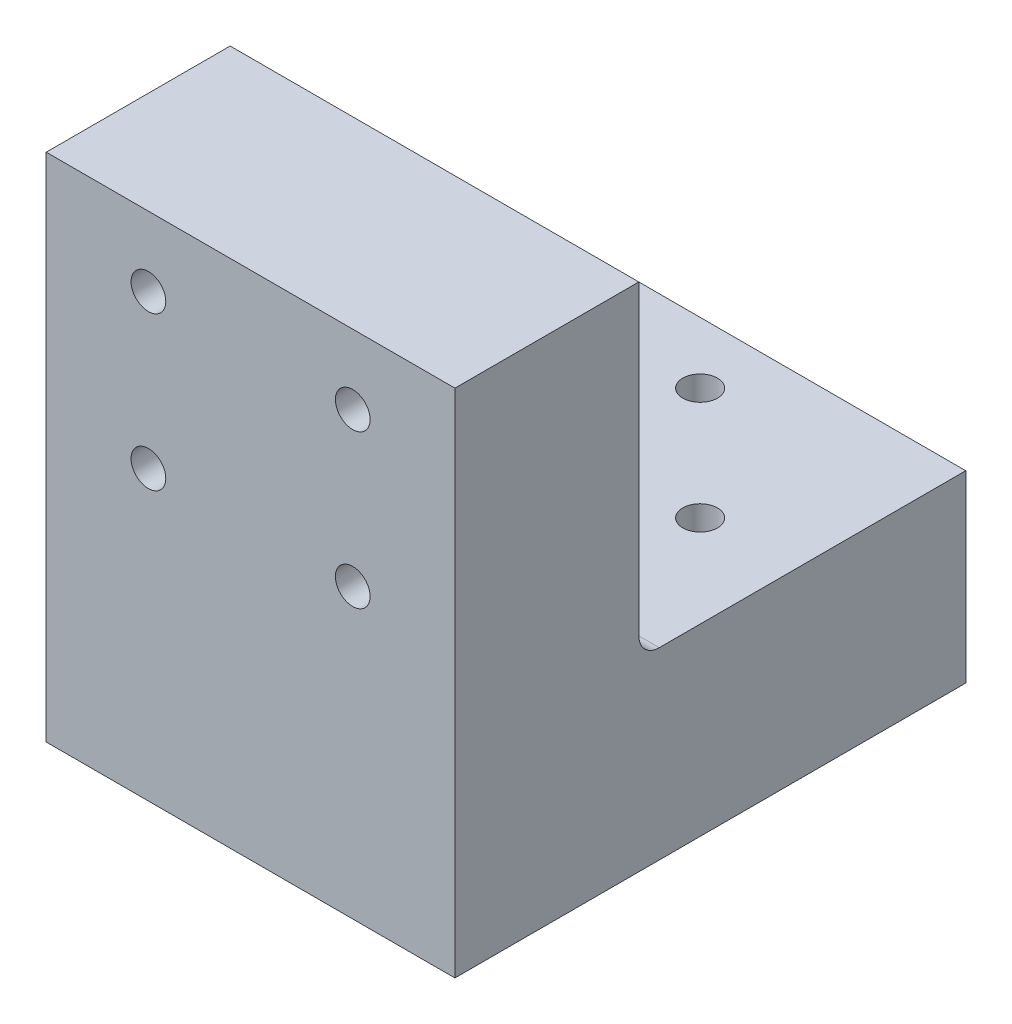
ISO-10303-21;
HEADER;
FILE_DESCRIPTION(('STEP AP214'),'2;1');
FILE_NAME('part.step','',(''),(''),'','','');
FILE_SCHEMA(('AUTOMOTIVE_DESIGN { 1 0 10303 214 1 1 1 1 }'));
ENDSEC;
DATA;
#1=APPLICATION_CONTEXT('core data for automotive mechanical design processes');
#2=APPLICATION_PROTOCOL_DEFINITION('international standard','automotive_design',2000,#1);
#3=PRODUCT_CONTEXT('',#1,'mechanical');
#4=PRODUCT('Part','Part','',(#3));
#5=PRODUCT_RELATED_PRODUCT_CATEGORY('part','',(#4));
#6=PRODUCT_DEFINITION_FORMATION('','',#4);
#7=PRODUCT_DEFINITION_CONTEXT('part definition',#1,'design');
#8=PRODUCT_DEFINITION('design','',#6,#7);
#9=PRODUCT_DEFINITION_SHAPE('','',#8);
#10=(LENGTH_UNIT() NAMED_UNIT(*) SI_UNIT(.MILLI.,.METRE.));
#11=(NAMED_UNIT(*) PLANE_ANGLE_UNIT() SI_UNIT($,.RADIAN.));
#12=(NAMED_UNIT(*) SI_UNIT($,.STERADIAN.) SOLID_ANGLE_UNIT());
#13=UNCERTAINTY_MEASURE_WITH_UNIT(LENGTH_MEASURE(1.E-05),#10,'distance_accuracy_value','');
#14=(GEOMETRIC_REPRESENTATION_CONTEXT(3) GLOBAL_UNCERTAINTY_ASSIGNED_CONTEXT((#13)) GLOBAL_UNIT_ASSIGNED_CONTEXT((#10,
#11,#12)) REPRESENTATION_CONTEXT('',''));
#15=CARTESIAN_POINT('',(0.,0.,0.));
#16=DIRECTION('',(0.,0.,1.));
#17=DIRECTION('',(1.,0.,0.));
#18=AXIS2_PLACEMENT_3D('',#15,#16,#17);
#19=CARTESIAN_POINT('',(40.,-23.186119873817,0.));
#20=DIRECTION('',(0.,0.,-1.));
#21=DIRECTION('',(-1.,0.,0.));
#22=AXIS2_PLACEMENT_3D('',#19,#20,#21);
#23=PLANE('',#22);
#24=CARTESIAN_POINT('',(10.,20.,0.));
#25=DIRECTION('',(0.,0.,-1.));
#26=DIRECTION('',(0.,1.,0.));
#27=AXIS2_PLACEMENT_3D('',#24,#25,#26);
#28=CIRCLE('',#27,1.7);
#29=CARTESIAN_POINT('',(10.,21.7,0.));
#30=VERTEX_POINT('',#29);
#31=EDGE_CURVE('E248',#30,#30,#28,.T.);
#32=ORIENTED_EDGE('',*,*,#31,.T.);
#33=EDGE_LOOP('',(#32));
#34=FACE_BOUND('',#33,.T.);
#35=CARTESIAN_POINT('',(30.,5.,0.));
#36=DIRECTION('',(0.,0.,-1.));
#37=DIRECTION('',(0.,1.,0.));
#38=AXIS2_PLACEMENT_3D('',#35,#36,#37);
#39=CIRCLE('',#38,1.7);
#40=CARTESIAN_POINT('',(30.,6.7,0.));
#41=VERTEX_POINT('',#40);
#42=EDGE_CURVE('E238',#41,#41,#39,.T.);
#43=ORIENTED_EDGE('',*,*,#42,.T.);
#44=EDGE_LOOP('',(#43));
#45=FACE_BOUND('',#44,.T.);
#46=CARTESIAN_POINT('',(10.,5.,0.));
#47=DIRECTION('',(0.,0.,-1.));
#48=DIRECTION('',(0.,1.,0.));
#49=AXIS2_PLACEMENT_3D('',#46,#47,#48);
#50=CIRCLE('',#49,1.7);
#51=CARTESIAN_POINT('',(10.,6.7,0.));
#52=VERTEX_POINT('',#51);
#53=EDGE_CURVE('E258',#52,#52,#50,.T.);
#54=ORIENTED_EDGE('',*,*,#53,.T.);
#55=EDGE_LOOP('',(#54));
#56=FACE_BOUND('',#55,.T.);
#57=CARTESIAN_POINT('',(30.,20.,0.));
#58=DIRECTION('',(0.,0.,-1.));
#59=DIRECTION('',(0.,1.,0.));
#60=AXIS2_PLACEMENT_3D('',#57,#58,#59);
#61=CIRCLE('',#60,1.7);
#62=CARTESIAN_POINT('',(30.,21.7,0.));
#63=VERTEX_POINT('',#62);
#64=EDGE_CURVE('E222',#63,#63,#61,.T.);
#65=ORIENTED_EDGE('',*,*,#64,.T.);
#66=EDGE_LOOP('',(#65));
#67=FACE_BOUND('',#66,.T.);
#68=DIRECTION('',(0.,-1.,0.));
#69=VECTOR('',#68,1.);
#70=CARTESIAN_POINT('',(0.,-23.186119873817,0.));
#71=LINE('',#70,#69);
#72=CARTESIAN_POINT('',(0.,26.813880126183,0.));
#73=VERTEX_POINT('',#72);
#74=CARTESIAN_POINT('',(0.,-23.186119873817,0.));
#75=VERTEX_POINT('',#74);
#76=EDGE_CURVE('E139',#73,#75,#71,.T.);
#77=ORIENTED_EDGE('',*,*,#76,.T.);
#78=DIRECTION('',(-1.,0.,0.));
#79=VECTOR('',#78,1.);
#80=CARTESIAN_POINT('',(40.,-23.186119873817,0.));
#81=LINE('',#80,#79);
#82=CARTESIAN_POINT('',(40.,-23.186119873817,0.));
#83=VERTEX_POINT('',#82);
#84=EDGE_CURVE('E11',#83,#75,#81,.T.);
#85=ORIENTED_EDGE('',*,*,#84,.F.);
#86=DIRECTION('',(0.,-1.,0.));
#87=VECTOR('',#86,1.);
#88=CARTESIAN_POINT('',(40.,-23.186119873817,0.));
#89=LINE('',#88,#87);
#90=CARTESIAN_POINT('',(40.,26.813880126183,0.));
#91=VERTEX_POINT('',#90);
#92=EDGE_CURVE('E159',#91,#83,#89,.T.);
#93=ORIENTED_EDGE('',*,*,#92,.F.);
#94=DIRECTION('',(-1.,0.,0.));
#95=VECTOR('',#94,1.);
#96=CARTESIAN_POINT('',(40.,26.813880126183,0.));
#97=LINE('',#96,#95);
#98=EDGE_CURVE('E136',#91,#73,#97,.T.);
#99=ORIENTED_EDGE('',*,*,#98,.T.);
#100=EDGE_LOOP('',(#77,#85,#93,#99));
#101=FACE_BOUND('',#100,.T.);
#102=ADVANCED_FACE('F44',(#34,#45,#56,#67,#101),#23,.F.);
#103=CARTESIAN_POINT('',(40.,-23.186119873817,0.));
#104=DIRECTION('',(0.,1.,0.));
#105=DIRECTION('',(0.,0.,1.));
#106=AXIS2_PLACEMENT_3D('',#103,#104,#105);
#107=PLANE('',#106);
#108=CARTESIAN_POINT('',(9.,-23.186119873817,-33.));
#109=DIRECTION('',(0.,1.,0.));
#110=DIRECTION('',(0.,0.,1.));
#111=AXIS2_PLACEMENT_3D('',#108,#109,#110);
#112=CIRCLE('',#111,1.7);
#113=CARTESIAN_POINT('',(9.,-23.186119873817,-31.3));
#114=VERTEX_POINT('',#113);
#115=EDGE_CURVE('E207',#114,#114,#112,.T.);
#116=ORIENTED_EDGE('',*,*,#115,.T.);
#117=EDGE_LOOP('',(#116));
#118=FACE_BOUND('',#117,.T.);
#119=CARTESIAN_POINT('',(20.,-23.186119873817,-44.));
#120=DIRECTION('',(0.,1.,0.));
#121=DIRECTION('',(0.,0.,1.));
#122=AXIS2_PLACEMENT_3D('',#119,#120,#121);
#123=CIRCLE('',#122,1.7);
#124=CARTESIAN_POINT('',(20.,-23.186119873817,-42.3));
#125=VERTEX_POINT('',#124);
#126=EDGE_CURVE('E199',#125,#125,#123,.T.);
#127=ORIENTED_EDGE('',*,*,#126,.T.);
#128=EDGE_LOOP('',(#127));
#129=FACE_BOUND('',#128,.T.);
#130=CARTESIAN_POINT('',(31.,-23.186119873817,-33.));
#131=DIRECTION('',(0.,1.,0.));
#132=DIRECTION('',(0.,0.,1.));
#133=AXIS2_PLACEMENT_3D('',#130,#131,#132);
#134=CIRCLE('',#133,1.7);
#135=CARTESIAN_POINT('',(31.,-23.186119873817,-31.3));
#136=VERTEX_POINT('',#135);
#137=EDGE_CURVE('E223',#136,#136,#134,.T.);
#138=ORIENTED_EDGE('',*,*,#137,.T.);
#139=EDGE_LOOP('',(#138));
#140=FACE_BOUND('',#139,.T.);
#141=CARTESIAN_POINT('',(20.,-23.186119873817,-22.));
#142=DIRECTION('',(0.,1.,0.));
#143=DIRECTION('',(0.,0.,1.));
#144=AXIS2_PLACEMENT_3D('',#141,#142,#143);
#145=CIRCLE('',#144,1.7);
#146=CARTESIAN_POINT('',(20.,-23.186119873817,-20.3));
#147=VERTEX_POINT('',#146);
#148=EDGE_CURVE('E216',#147,#147,#145,.T.);
#149=ORIENTED_EDGE('',*,*,#148,.T.);
#150=EDGE_LOOP('',(#149));
#151=FACE_BOUND('',#150,.T.);
#152=CARTESIAN_POINT('',(20.,-23.186119873817,-33.));
#153=DIRECTION('',(0.,1.,0.));
#154=DIRECTION('',(0.,0.,1.));
#155=AXIS2_PLACEMENT_3D('',#152,#153,#154);
#156=CIRCLE('',#155,3.25000000000001);
#157=CARTESIAN_POINT('',(20.,-23.186119873817,-29.75));
#158=VERTEX_POINT('',#157);
#159=EDGE_CURVE('E144',#158,#158,#156,.T.);
#160=ORIENTED_EDGE('',*,*,#159,.T.);
#161=EDGE_LOOP('',(#160));
#162=FACE_BOUND('',#161,.T.);
#163=DIRECTION('',(0.,0.,-1.));
#164=VECTOR('',#163,1.);
#165=CARTESIAN_POINT('',(0.,-23.186119873817,0.));
#166=LINE('',#165,#164);
#167=CARTESIAN_POINT('',(0.,-23.186119873817,-50.));
#168=VERTEX_POINT('',#167);
#169=EDGE_CURVE('E145',#75,#168,#166,.T.);
#170=ORIENTED_EDGE('',*,*,#169,.T.);
#171=DIRECTION('',(-1.,0.,0.));
#172=VECTOR('',#171,1.);
#173=CARTESIAN_POINT('',(40.,-23.186119873817,-50.));
#174=LINE('',#173,#172);
#175=CARTESIAN_POINT('',(40.,-23.186119873817,-50.));
#176=VERTEX_POINT('',#175);
#177=EDGE_CURVE('E53',#176,#168,#174,.T.);
#178=ORIENTED_EDGE('',*,*,#177,.F.);
#179=DIRECTION('',(0.,0.,-1.));
#180=VECTOR('',#179,1.);
#181=CARTESIAN_POINT('',(40.,-23.186119873817,0.));
#182=LINE('',#181,#180);
#183=EDGE_CURVE('E105',#83,#176,#182,.T.);
#184=ORIENTED_EDGE('',*,*,#183,.F.);
#185=ORIENTED_EDGE('',*,*,#84,.T.);
#186=EDGE_LOOP('',(#170,#178,#184,#185));
#187=FACE_BOUND('',#186,.T.);
#188=ADVANCED_FACE('F295',(#118,#129,#140,#151,#162,#187),#107,.F.);
#189=CARTESIAN_POINT('',(40.,-23.186119873817,-50.));
#190=DIRECTION('',(0.,0.,1.));
#191=DIRECTION('',(1.,0.,0.));
#192=AXIS2_PLACEMENT_3D('',#189,#190,#191);
#193=PLANE('',#192);
#194=DIRECTION('',(0.,1.,0.));
#195=VECTOR('',#194,1.);
#196=CARTESIAN_POINT('',(0.,-23.186119873817,-50.));
#197=LINE('',#196,#195);
#198=CARTESIAN_POINT('',(0.,-5.18611987381702,-50.));
#199=VERTEX_POINT('',#198);
#200=EDGE_CURVE('E146',#168,#199,#197,.T.);
#201=ORIENTED_EDGE('',*,*,#200,.T.);
#202=DIRECTION('',(-1.,0.,0.));
#203=VECTOR('',#202,1.);
#204=CARTESIAN_POINT('',(40.,-5.18611987381702,-50.));
#205=LINE('',#204,#203);
#206=CARTESIAN_POINT('',(40.,-5.18611987381702,-50.));
#207=VERTEX_POINT('',#206);
#208=EDGE_CURVE('E170',#207,#199,#205,.T.);
#209=ORIENTED_EDGE('',*,*,#208,.F.);
#210=DIRECTION('',(0.,1.,0.));
#211=VECTOR('',#210,1.);
#212=CARTESIAN_POINT('',(40.,-23.186119873817,-50.));
#213=LINE('',#212,#211);
#214=EDGE_CURVE('E180',#176,#207,#213,.T.);
#215=ORIENTED_EDGE('',*,*,#214,.F.);
#216=ORIENTED_EDGE('',*,*,#177,.T.);
#217=EDGE_LOOP('',(#201,#209,#215,#216));
#218=FACE_BOUND('',#217,.T.);
#219=ADVANCED_FACE('F174',(#218),#193,.F.);
#220=CARTESIAN_POINT('',(40.,-5.18611987381702,-20.));
#221=DIRECTION('',(0.,-1.,0.));
#222=DIRECTION('',(0.,0.,-1.));
#223=AXIS2_PLACEMENT_3D('',#220,#221,#222);
#224=PLANE('',#223);
#225=CARTESIAN_POINT('',(9.,-5.18611987381702,-33.));
#226=DIRECTION('',(0.,1.,0.));
#227=DIRECTION('',(0.,0.,1.));
#228=AXIS2_PLACEMENT_3D('',#225,#226,#227);
#229=CIRCLE('',#228,1.7);
#230=CARTESIAN_POINT('',(9.,-5.18611987381702,-31.3));
#231=VERTEX_POINT('',#230);
#232=EDGE_CURVE('E198',#231,#231,#229,.T.);
#233=ORIENTED_EDGE('',*,*,#232,.F.);
#234=EDGE_LOOP('',(#233));
#235=FACE_BOUND('',#234,.T.);
#236=CARTESIAN_POINT('',(20.,-5.18611987381702,-44.));
#237=DIRECTION('',(0.,1.,0.));
#238=DIRECTION('',(0.,0.,1.));
#239=AXIS2_PLACEMENT_3D('',#236,#237,#238);
#240=CIRCLE('',#239,1.7);
#241=CARTESIAN_POINT('',(20.,-5.18611987381702,-42.3));
#242=VERTEX_POINT('',#241);
#243=EDGE_CURVE('E204',#242,#242,#240,.T.);
#244=ORIENTED_EDGE('',*,*,#243,.F.);
#245=EDGE_LOOP('',(#244));
#246=FACE_BOUND('',#245,.T.);
#247=CARTESIAN_POINT('',(31.,-5.18611987381702,-33.));
#248=DIRECTION('',(0.,1.,0.));
#249=DIRECTION('',(0.,0.,1.));
#250=AXIS2_PLACEMENT_3D('',#247,#248,#249);
#251=CIRCLE('',#250,1.7);
#252=CARTESIAN_POINT('',(31.,-5.18611987381702,-31.3));
#253=VERTEX_POINT('',#252);
#254=EDGE_CURVE('E202',#253,#253,#251,.T.);
#255=ORIENTED_EDGE('',*,*,#254,.F.);
#256=EDGE_LOOP('',(#255));
#257=FACE_BOUND('',#256,.T.);
#258=CARTESIAN_POINT('',(20.,-5.18611987381702,-22.));
#259=DIRECTION('',(0.,1.,0.));
#260=DIRECTION('',(0.,0.,1.));
#261=AXIS2_PLACEMENT_3D('',#258,#259,#260);
#262=CIRCLE('',#261,1.7);
#263=CARTESIAN_POINT('',(20.,-5.18611987381702,-20.3));
#264=VERTEX_POINT('',#263);
#265=EDGE_CURVE('E219',#264,#264,#262,.T.);
#266=ORIENTED_EDGE('',*,*,#265,.F.);
#267=EDGE_LOOP('',(#266));
#268=FACE_BOUND('',#267,.T.);
#269=CARTESIAN_POINT('',(20.,-5.18611987381702,-33.));
#270=DIRECTION('',(0.,1.,0.));
#271=DIRECTION('',(0.,0.,1.));
#272=AXIS2_PLACEMENT_3D('',#269,#270,#271);
#273=CIRCLE('',#272,3.25000000000001);
#274=CARTESIAN_POINT('',(20.,-5.18611987381702,-29.75));
#275=VERTEX_POINT('',#274);
#276=EDGE_CURVE('E195',#275,#275,#273,.T.);
#277=ORIENTED_EDGE('',*,*,#276,.F.);
#278=EDGE_LOOP('',(#277));
#279=FACE_BOUND('',#278,.T.);
#280=DIRECTION('',(0.,0.,1.));
#281=VECTOR('',#280,1.);
#282=CARTESIAN_POINT('',(0.,-5.18611987381702,-20.));
#283=LINE('',#282,#281);
#284=CARTESIAN_POINT('',(0.,-5.18611987381702,-20.));
#285=VERTEX_POINT('',#284);
#286=EDGE_CURVE('E151',#199,#285,#283,.T.);
#287=ORIENTED_EDGE('',*,*,#286,.T.);
#288=DIRECTION('',(-1.,0.,0.));
#289=VECTOR('',#288,1.);
#290=CARTESIAN_POINT('',(40.,-5.18611987381702,-20.));
#291=LINE('',#290,#289);
#292=CARTESIAN_POINT('',(40.,-5.18611987381702,-20.));
#293=VERTEX_POINT('',#292);
#294=EDGE_CURVE('E129',#293,#285,#291,.T.);
#295=ORIENTED_EDGE('',*,*,#294,.F.);
#296=DIRECTION('',(0.,0.,1.));
#297=VECTOR('',#296,1.);
#298=CARTESIAN_POINT('',(40.,-5.18611987381702,-20.));
#299=LINE('',#298,#297);
#300=EDGE_CURVE('E117',#207,#293,#299,.T.);
#301=ORIENTED_EDGE('',*,*,#300,.F.);
#302=ORIENTED_EDGE('',*,*,#208,.T.);
#303=EDGE_LOOP('',(#287,#295,#301,#302));
#304=FACE_BOUND('',#303,.T.);
#305=ADVANCED_FACE('F181',(#235,#246,#257,#268,#279,#304),#224,.F.);
#306=CARTESIAN_POINT('',(40.,-3.18611987381702,-20.));
#307=DIRECTION('',(-1.,0.,0.));
#308=DIRECTION('',(0.,0.,1.));
#309=AXIS2_PLACEMENT_3D('',#306,#307,#308);
#310=CYLINDRICAL_SURFACE('',#309,2.);
#311=CARTESIAN_POINT('',(0.,-3.18611987381702,-20.));
#312=DIRECTION('',(-1.,0.,0.));
#313=DIRECTION('',(0.,0.,-1.));
#314=AXIS2_PLACEMENT_3D('',#311,#312,#313);
#315=CIRCLE('',#314,2.);
#316=CARTESIAN_POINT('',(0.,-3.18611987381702,-18.));
#317=VERTEX_POINT('',#316);
#318=EDGE_CURVE('E130',#285,#317,#315,.T.);
#319=ORIENTED_EDGE('',*,*,#318,.T.);
#320=DIRECTION('',(-1.,0.,0.));
#321=VECTOR('',#320,1.);
#322=CARTESIAN_POINT('',(40.,-3.18611987381702,-18.));
#323=LINE('',#322,#321);
#324=CARTESIAN_POINT('',(40.,-3.18611987381702,-18.));
#325=VERTEX_POINT('',#324);
#326=EDGE_CURVE('E123',#325,#317,#323,.T.);
#327=ORIENTED_EDGE('',*,*,#326,.F.);
#328=CARTESIAN_POINT('',(40.,-3.18611987381702,-20.));
#329=DIRECTION('',(-1.,0.,0.));
#330=DIRECTION('',(0.,0.,-1.));
#331=AXIS2_PLACEMENT_3D('',#328,#329,#330);
#332=CIRCLE('',#331,2.);
#333=EDGE_CURVE('E115',#293,#325,#332,.T.);
#334=ORIENTED_EDGE('',*,*,#333,.F.);
#335=ORIENTED_EDGE('',*,*,#294,.T.);
#336=EDGE_LOOP('',(#319,#327,#334,#335));
#337=FACE_BOUND('',#336,.T.);
#338=ADVANCED_FACE('F124',(#337),#310,.F.);
#339=CARTESIAN_POINT('',(40.,26.813880126183,-18.));
#340=DIRECTION('',(0.,0.,1.));
#341=DIRECTION('',(0.,-1.,0.));
#342=AXIS2_PLACEMENT_3D('',#339,#340,#341);
#343=PLANE('',#342);
#344=CARTESIAN_POINT('',(10.,20.,-18.));
#345=DIRECTION('',(0.,0.,-1.));
#346=DIRECTION('',(0.,1.,0.));
#347=AXIS2_PLACEMENT_3D('',#344,#345,#346);
#348=CIRCLE('',#347,1.7);
#349=CARTESIAN_POINT('',(10.,21.7,-18.));
#350=VERTEX_POINT('',#349);
#351=EDGE_CURVE('E237',#350,#350,#348,.T.);
#352=ORIENTED_EDGE('',*,*,#351,.F.);
#353=EDGE_LOOP('',(#352));
#354=FACE_BOUND('',#353,.T.);
#355=CARTESIAN_POINT('',(30.,5.,-18.));
#356=DIRECTION('',(0.,0.,-1.));
#357=DIRECTION('',(0.,1.,0.));
#358=AXIS2_PLACEMENT_3D('',#355,#356,#357);
#359=CIRCLE('',#358,1.7);
#360=CARTESIAN_POINT('',(30.,6.7,-18.));
#361=VERTEX_POINT('',#360);
#362=EDGE_CURVE('E243',#361,#361,#359,.T.);
#363=ORIENTED_EDGE('',*,*,#362,.F.);
#364=EDGE_LOOP('',(#363));
#365=FACE_BOUND('',#364,.T.);
#366=CARTESIAN_POINT('',(10.,5.,-18.));
#367=DIRECTION('',(0.,0.,-1.));
#368=DIRECTION('',(0.,1.,0.));
#369=AXIS2_PLACEMENT_3D('',#366,#367,#368);
#370=CIRCLE('',#369,1.7);
#371=CARTESIAN_POINT('',(10.,6.7,-18.));
#372=VERTEX_POINT('',#371);
#373=EDGE_CURVE('E244',#372,#372,#370,.T.);
#374=ORIENTED_EDGE('',*,*,#373,.F.);
#375=EDGE_LOOP('',(#374));
#376=FACE_BOUND('',#375,.T.);
#377=CARTESIAN_POINT('',(30.,20.,-18.));
#378=DIRECTION('',(0.,0.,-1.));
#379=DIRECTION('',(0.,1.,0.));
#380=AXIS2_PLACEMENT_3D('',#377,#378,#379);
#381=CIRCLE('',#380,1.7);
#382=CARTESIAN_POINT('',(30.,21.7,-18.));
#383=VERTEX_POINT('',#382);
#384=EDGE_CURVE('E235',#383,#383,#381,.T.);
#385=ORIENTED_EDGE('',*,*,#384,.F.);
#386=EDGE_LOOP('',(#385));
#387=FACE_BOUND('',#386,.T.);
#388=DIRECTION('',(0.,1.,0.));
#389=VECTOR('',#388,1.);
#390=CARTESIAN_POINT('',(0.,26.813880126183,-18.));
#391=LINE('',#390,#389);
#392=CARTESIAN_POINT('',(0.,26.813880126183,-18.));
#393=VERTEX_POINT('',#392);
#394=EDGE_CURVE('E86',#317,#393,#391,.T.);
#395=ORIENTED_EDGE('',*,*,#394,.T.);
#396=DIRECTION('',(-1.,0.,0.));
#397=VECTOR('',#396,1.);
#398=CARTESIAN_POINT('',(40.,26.813880126183,-18.));
#399=LINE('',#398,#397);
#400=CARTESIAN_POINT('',(40.,26.813880126183,-18.));
#401=VERTEX_POINT('',#400);
#402=EDGE_CURVE('E128',#401,#393,#399,.T.);
#403=ORIENTED_EDGE('',*,*,#402,.F.);
#404=DIRECTION('',(0.,1.,0.));
#405=VECTOR('',#404,1.);
#406=CARTESIAN_POINT('',(40.,26.813880126183,-18.));
#407=LINE('',#406,#405);
#408=EDGE_CURVE('E116',#325,#401,#407,.T.);
#409=ORIENTED_EDGE('',*,*,#408,.F.);
#410=ORIENTED_EDGE('',*,*,#326,.T.);
#411=EDGE_LOOP('',(#395,#403,#409,#410));
#412=FACE_BOUND('',#411,.T.);
#413=ADVANCED_FACE('F135',(#354,#365,#376,#387,#412),#343,.F.);
#414=CARTESIAN_POINT('',(40.,26.813880126183,0.));
#415=DIRECTION('',(0.,-1.,0.));
#416=DIRECTION('',(0.,0.,-1.));
#417=AXIS2_PLACEMENT_3D('',#414,#415,#416);
#418=PLANE('',#417);
#419=DIRECTION('',(0.,0.,1.));
#420=VECTOR('',#419,1.);
#421=CARTESIAN_POINT('',(0.,26.813880126183,0.));
#422=LINE('',#421,#420);
#423=EDGE_CURVE('E94',#393,#73,#422,.T.);
#424=ORIENTED_EDGE('',*,*,#423,.T.);
#425=ORIENTED_EDGE('',*,*,#98,.F.);
#426=DIRECTION('',(0.,0.,1.));
#427=VECTOR('',#426,1.);
#428=CARTESIAN_POINT('',(40.,26.813880126183,0.));
#429=LINE('',#428,#427);
#430=EDGE_CURVE('E65',#401,#91,#429,.T.);
#431=ORIENTED_EDGE('',*,*,#430,.F.);
#432=ORIENTED_EDGE('',*,*,#402,.T.);
#433=EDGE_LOOP('',(#424,#425,#431,#432));
#434=FACE_BOUND('',#433,.T.);
#435=ADVANCED_FACE('F268',(#434),#418,.F.);
#436=CARTESIAN_POINT('',(40.,-3.18611987381702,-20.));
#437=DIRECTION('',(1.,0.,0.));
#438=DIRECTION('',(0.,0.,-1.));
#439=AXIS2_PLACEMENT_3D('',#436,#437,#438);
#440=PLANE('',#439);
#441=ORIENTED_EDGE('',*,*,#92,.T.);
#442=ORIENTED_EDGE('',*,*,#183,.T.);
#443=ORIENTED_EDGE('',*,*,#214,.T.);
#444=ORIENTED_EDGE('',*,*,#300,.T.);
#445=ORIENTED_EDGE('',*,*,#333,.T.);
#446=ORIENTED_EDGE('',*,*,#408,.T.);
#447=ORIENTED_EDGE('',*,*,#430,.T.);
#448=EDGE_LOOP('',(#441,#442,#443,#444,#445,#446,#447));
#449=FACE_BOUND('',#448,.T.);
#450=ADVANCED_FACE('F111',(#449),#440,.T.);
#451=CARTESIAN_POINT('',(0.,-3.18611987381702,-20.));
#452=DIRECTION('',(1.,0.,0.));
#453=DIRECTION('',(0.,0.,-1.));
#454=AXIS2_PLACEMENT_3D('',#451,#452,#453);
#455=PLANE('',#454);
#456=ORIENTED_EDGE('',*,*,#76,.F.);
#457=ORIENTED_EDGE('',*,*,#423,.F.);
#458=ORIENTED_EDGE('',*,*,#394,.F.);
#459=ORIENTED_EDGE('',*,*,#318,.F.);
#460=ORIENTED_EDGE('',*,*,#286,.F.);
#461=ORIENTED_EDGE('',*,*,#200,.F.);
#462=ORIENTED_EDGE('',*,*,#169,.F.);
#463=EDGE_LOOP('',(#456,#457,#458,#459,#460,#461,#462));
#464=FACE_BOUND('',#463,.T.);
#465=ADVANCED_FACE('F182',(#464),#455,.F.);
#466=CARTESIAN_POINT('',(20.,-23.186119873817,-33.));
#467=DIRECTION('',(0.,1.,0.));
#468=DIRECTION('',(0.,0.,1.));
#469=AXIS2_PLACEMENT_3D('',#466,#467,#468);
#470=CYLINDRICAL_SURFACE('',#469,3.25000000000001);
#471=ORIENTED_EDGE('',*,*,#159,.F.);
#472=EDGE_LOOP('',(#471));
#473=FACE_BOUND('',#472,.T.);
#474=ORIENTED_EDGE('',*,*,#276,.T.);
#475=EDGE_LOOP('',(#474));
#476=FACE_BOUND('',#475,.T.);
#477=ADVANCED_FACE('F358',(#473,#476),#470,.F.);
#478=CARTESIAN_POINT('',(20.,-23.186119873817,-22.));
#479=DIRECTION('',(0.,1.,0.));
#480=DIRECTION('',(0.,0.,1.));
#481=AXIS2_PLACEMENT_3D('',#478,#479,#480);
#482=CYLINDRICAL_SURFACE('',#481,1.7);
#483=ORIENTED_EDGE('',*,*,#148,.F.);
#484=EDGE_LOOP('',(#483));
#485=FACE_BOUND('',#484,.T.);
#486=ORIENTED_EDGE('',*,*,#265,.T.);
#487=EDGE_LOOP('',(#486));
#488=FACE_BOUND('',#487,.T.);
#489=ADVANCED_FACE('F370',(#485,#488),#482,.F.);
#490=CARTESIAN_POINT('',(31.,-23.186119873817,-33.));
#491=DIRECTION('',(0.,1.,0.));
#492=DIRECTION('',(0.,0.,1.));
#493=AXIS2_PLACEMENT_3D('',#490,#491,#492);
#494=CYLINDRICAL_SURFACE('',#493,1.7);
#495=ORIENTED_EDGE('',*,*,#137,.F.);
#496=EDGE_LOOP('',(#495));
#497=FACE_BOUND('',#496,.T.);
#498=ORIENTED_EDGE('',*,*,#254,.T.);
#499=EDGE_LOOP('',(#498));
#500=FACE_BOUND('',#499,.T.);
#501=ADVANCED_FACE('F380',(#497,#500),#494,.F.);
#502=CARTESIAN_POINT('',(20.,-23.186119873817,-44.));
#503=DIRECTION('',(0.,1.,0.));
#504=DIRECTION('',(0.,0.,1.));
#505=AXIS2_PLACEMENT_3D('',#502,#503,#504);
#506=CYLINDRICAL_SURFACE('',#505,1.7);
#507=ORIENTED_EDGE('',*,*,#126,.F.);
#508=EDGE_LOOP('',(#507));
#509=FACE_BOUND('',#508,.T.);
#510=ORIENTED_EDGE('',*,*,#243,.T.);
#511=EDGE_LOOP('',(#510));
#512=FACE_BOUND('',#511,.T.);
#513=ADVANCED_FACE('F284',(#509,#512),#506,.F.);
#514=CARTESIAN_POINT('',(9.,-23.186119873817,-33.));
#515=DIRECTION('',(0.,1.,0.));
#516=DIRECTION('',(0.,0.,1.));
#517=AXIS2_PLACEMENT_3D('',#514,#515,#516);
#518=CYLINDRICAL_SURFACE('',#517,1.7);
#519=ORIENTED_EDGE('',*,*,#115,.F.);
#520=EDGE_LOOP('',(#519));
#521=FACE_BOUND('',#520,.T.);
#522=ORIENTED_EDGE('',*,*,#232,.T.);
#523=EDGE_LOOP('',(#522));
#524=FACE_BOUND('',#523,.T.);
#525=ADVANCED_FACE('F274',(#521,#524),#518,.F.);
#526=CARTESIAN_POINT('',(30.,20.,0.));
#527=DIRECTION('',(0.,0.,-1.));
#528=DIRECTION('',(0.,1.,0.));
#529=AXIS2_PLACEMENT_3D('',#526,#527,#528);
#530=CYLINDRICAL_SURFACE('',#529,1.7);
#531=ORIENTED_EDGE('',*,*,#64,.F.);
#532=EDGE_LOOP('',(#531));
#533=FACE_BOUND('',#532,.T.);
#534=ORIENTED_EDGE('',*,*,#384,.T.);
#535=EDGE_LOOP('',(#534));
#536=FACE_BOUND('',#535,.T.);
#537=ADVANCED_FACE('F272',(#533,#536),#530,.F.);
#538=CARTESIAN_POINT('',(10.,5.,0.));
#539=DIRECTION('',(0.,0.,-1.));
#540=DIRECTION('',(0.,1.,0.));
#541=AXIS2_PLACEMENT_3D('',#538,#539,#540);
#542=CYLINDRICAL_SURFACE('',#541,1.7);
#543=ORIENTED_EDGE('',*,*,#53,.F.);
#544=EDGE_LOOP('',(#543));
#545=FACE_BOUND('',#544,.T.);
#546=ORIENTED_EDGE('',*,*,#373,.T.);
#547=EDGE_LOOP('',(#546));
#548=FACE_BOUND('',#547,.T.);
#549=ADVANCED_FACE('F262',(#545,#548),#542,.F.);
#550=CARTESIAN_POINT('',(30.,5.,0.));
#551=DIRECTION('',(0.,0.,-1.));
#552=DIRECTION('',(0.,1.,0.));
#553=AXIS2_PLACEMENT_3D('',#550,#551,#552);
#554=CYLINDRICAL_SURFACE('',#553,1.7);
#555=ORIENTED_EDGE('',*,*,#42,.F.);
#556=EDGE_LOOP('',(#555));
#557=FACE_BOUND('',#556,.T.);
#558=ORIENTED_EDGE('',*,*,#362,.T.);
#559=EDGE_LOOP('',(#558));
#560=FACE_BOUND('',#559,.T.);
#561=ADVANCED_FACE('F281',(#557,#560),#554,.F.);
#562=CARTESIAN_POINT('',(10.,20.,0.));
#563=DIRECTION('',(0.,0.,-1.));
#564=DIRECTION('',(0.,1.,0.));
#565=AXIS2_PLACEMENT_3D('',#562,#563,#564);
#566=CYLINDRICAL_SURFACE('',#565,1.7);
#567=ORIENTED_EDGE('',*,*,#31,.F.);
#568=EDGE_LOOP('',(#567));
#569=FACE_BOUND('',#568,.T.);
#570=ORIENTED_EDGE('',*,*,#351,.T.);
#571=EDGE_LOOP('',(#570));
#572=FACE_BOUND('',#571,.T.);
#573=ADVANCED_FACE('F419',(#569,#572),#566,.F.);
#574=CLOSED_SHELL('',(#102,#188,#219,#305,#338,#413,#435,#450,#465,#477,#489,#501,#513,#525,
#537,#549,#561,#573));
#575=MANIFOLD_SOLID_BREP('B2',#574);
#576=ADVANCED_BREP_SHAPE_REPRESENTATION('',(#18,#575),#14);
#577=SHAPE_DEFINITION_REPRESENTATION(#9,#576);
ENDSEC;
END-ISO-10303-21;
